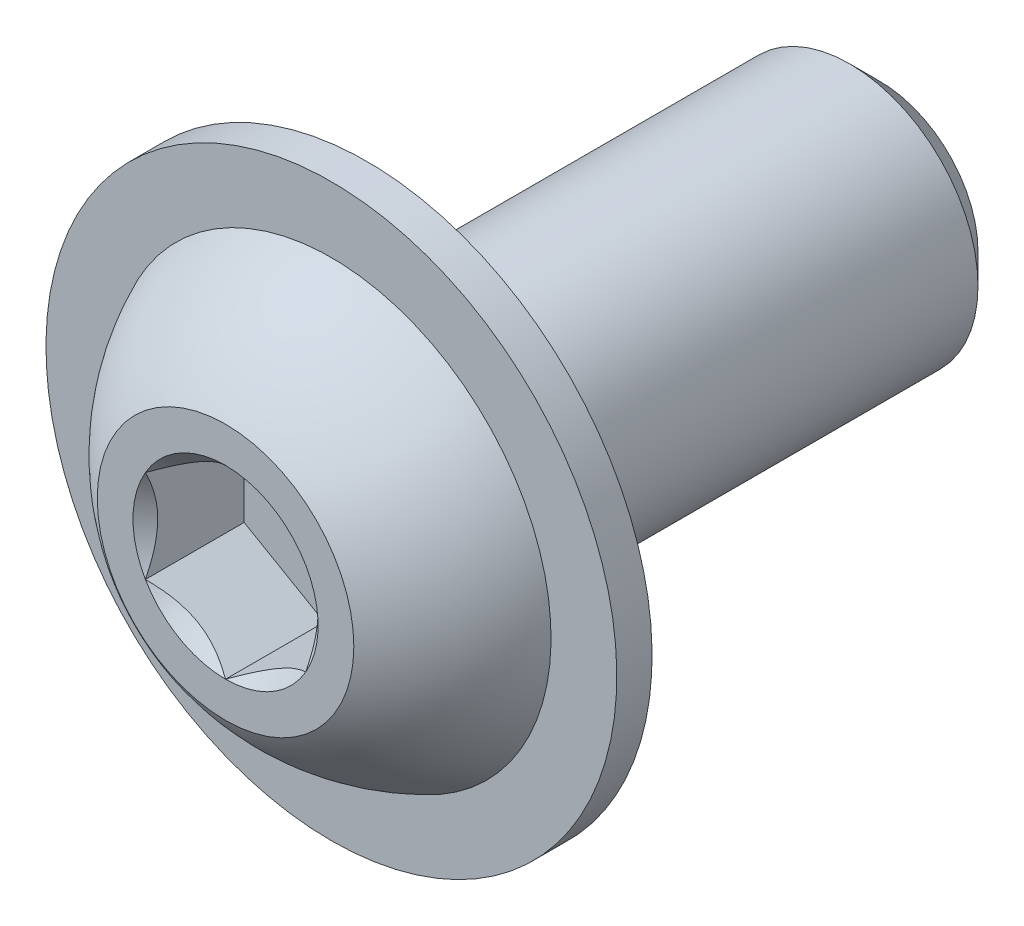
ISO-10303-21;
HEADER;
FILE_DESCRIPTION(('STEP AP214'),'2;1');
FILE_NAME('part.step','',(''),(''),'','','');
FILE_SCHEMA(('AUTOMOTIVE_DESIGN { 1 0 10303 214 1 1 1 1 }'));
ENDSEC;
DATA;
#1=APPLICATION_CONTEXT('core data for automotive mechanical design processes');
#2=APPLICATION_PROTOCOL_DEFINITION('international standard','automotive_design',2000,#1);
#3=PRODUCT_CONTEXT('',#1,'mechanical');
#4=PRODUCT('Part','Part','',(#3));
#5=PRODUCT_RELATED_PRODUCT_CATEGORY('part','',(#4));
#6=PRODUCT_DEFINITION_FORMATION('','',#4);
#7=PRODUCT_DEFINITION_CONTEXT('part definition',#1,'design');
#8=PRODUCT_DEFINITION('design','',#6,#7);
#9=PRODUCT_DEFINITION_SHAPE('','',#8);
#10=(LENGTH_UNIT() NAMED_UNIT(*) SI_UNIT(.MILLI.,.METRE.));
#11=(NAMED_UNIT(*) PLANE_ANGLE_UNIT() SI_UNIT($,.RADIAN.));
#12=(NAMED_UNIT(*) SI_UNIT($,.STERADIAN.) SOLID_ANGLE_UNIT());
#13=UNCERTAINTY_MEASURE_WITH_UNIT(LENGTH_MEASURE(1.E-05),#10,'distance_accuracy_value','');
#14=(GEOMETRIC_REPRESENTATION_CONTEXT(3) GLOBAL_UNCERTAINTY_ASSIGNED_CONTEXT((#13)) GLOBAL_UNIT_ASSIGNED_CONTEXT((#10,
#11,#12)) REPRESENTATION_CONTEXT('',''));
#15=CARTESIAN_POINT('',(0.,0.,0.));
#16=DIRECTION('',(0.,0.,1.));
#17=DIRECTION('',(1.,0.,0.));
#18=AXIS2_PLACEMENT_3D('',#15,#16,#17);
#19=CARTESIAN_POINT('',(0.,4.,-10.2));
#20=DIRECTION('',(0.,0.,1.));
#21=DIRECTION('',(1.,0.,0.));
#22=AXIS2_PLACEMENT_3D('',#19,#20,#21);
#23=PLANE('',#22);
#24=CARTESIAN_POINT('',(0.,0.,-10.2));
#25=DIRECTION('',(0.,0.,1.));
#26=DIRECTION('',(1.,0.,0.));
#27=AXIS2_PLACEMENT_3D('',#24,#25,#26);
#28=CIRCLE('',#27,3.0625);
#29=CARTESIAN_POINT('',(3.0625,0.,-10.2));
#30=VERTEX_POINT('',#29);
#31=EDGE_CURVE('E55',#30,#30,#28,.F.);
#32=ORIENTED_EDGE('',*,*,#31,.T.);
#33=EDGE_LOOP('',(#32));
#34=FACE_BOUND('',#33,.T.);
#35=ADVANCED_FACE('F40',(#34),#23,.F.);
#36=CARTESIAN_POINT('',(0.,0.,10.2));
#37=DIRECTION('',(0.,0.,1.));
#38=DIRECTION('',(1.,0.,0.));
#39=AXIS2_PLACEMENT_3D('',#36,#37,#38);
#40=CYLINDRICAL_SURFACE('',#39,4.);
#41=CARTESIAN_POINT('',(0.,0.,-9.2625));
#42=DIRECTION('',(0.,0.,1.));
#43=DIRECTION('',(1.,0.,0.));
#44=AXIS2_PLACEMENT_3D('',#41,#42,#43);
#45=CIRCLE('',#44,4.);
#46=CARTESIAN_POINT('',(4.,0.,-9.2625));
#47=VERTEX_POINT('',#46);
#48=EDGE_CURVE('E209',#47,#47,#45,.T.);
#49=ORIENTED_EDGE('',*,*,#48,.T.);
#50=EDGE_LOOP('',(#49));
#51=FACE_BOUND('',#50,.T.);
#52=CARTESIAN_POINT('',(0.,0.,5.8));
#53=DIRECTION('',(0.,0.,1.));
#54=DIRECTION('',(1.,0.,0.));
#55=AXIS2_PLACEMENT_3D('',#52,#53,#54);
#56=CIRCLE('',#55,4.);
#57=CARTESIAN_POINT('',(4.,0.,5.8));
#58=VERTEX_POINT('',#57);
#59=EDGE_CURVE('E205',#58,#58,#56,.T.);
#60=ORIENTED_EDGE('',*,*,#59,.F.);
#61=EDGE_LOOP('',(#60));
#62=FACE_BOUND('',#61,.T.);
#63=ADVANCED_FACE('F220',(#51,#62),#40,.T.);
#64=CARTESIAN_POINT('',(0.,0.,-9.2625));
#65=DIRECTION('',(0.,0.,1.));
#66=DIRECTION('',(1.,0.,0.));
#67=AXIS2_PLACEMENT_3D('',#64,#65,#66);
#68=CONICAL_SURFACE('',#67,4.,0.78539816339745);
#69=ORIENTED_EDGE('',*,*,#31,.F.);
#70=EDGE_LOOP('',(#69));
#71=FACE_BOUND('',#70,.T.);
#72=ORIENTED_EDGE('',*,*,#48,.F.);
#73=EDGE_LOOP('',(#72));
#74=FACE_BOUND('',#73,.T.);
#75=ADVANCED_FACE('F42',(#71,#74),#68,.T.);
#76=CARTESIAN_POINT('',(0.,-8.9,5.8));
#77=DIRECTION('',(0.,0.,1.));
#78=DIRECTION('',(0.,-1.,0.));
#79=AXIS2_PLACEMENT_3D('',#76,#77,#78);
#80=PLANE('',#79);
#81=CARTESIAN_POINT('',(0.,0.,5.8));
#82=DIRECTION('',(0.,0.,1.));
#83=DIRECTION('',(0.,-1.,0.));
#84=AXIS2_PLACEMENT_3D('',#81,#82,#83);
#85=CIRCLE('',#84,8.9);
#86=CARTESIAN_POINT('',(0.,-8.9,5.8));
#87=VERTEX_POINT('',#86);
#88=EDGE_CURVE('E197',#87,#87,#85,.T.);
#89=ORIENTED_EDGE('',*,*,#88,.F.);
#90=EDGE_LOOP('',(#89));
#91=FACE_BOUND('',#90,.T.);
#92=ORIENTED_EDGE('',*,*,#59,.T.);
#93=EDGE_LOOP('',(#92));
#94=FACE_BOUND('',#93,.T.);
#95=ADVANCED_FACE('F219',(#91,#94),#80,.F.);
#96=CARTESIAN_POINT('',(0.,0.,3.86477272727274));
#97=DIRECTION('',(0.,0.,1.));
#98=DIRECTION('',(0.,-1.,0.));
#99=AXIS2_PLACEMENT_3D('',#96,#97,#98);
#100=SPHERICAL_SURFACE('',#99,7.49233639108038);
#101=CARTESIAN_POINT('',(0.,0.,10.2));
#102=DIRECTION('',(0.,0.,1.));
#103=DIRECTION('',(0.,-1.,0.));
#104=AXIS2_PLACEMENT_3D('',#101,#102,#103);
#105=CIRCLE('',#104,4.);
#106=CARTESIAN_POINT('',(0.,-4.,10.2));
#107=VERTEX_POINT('',#106);
#108=EDGE_CURVE('E201',#107,#107,#105,.T.);
#109=CARTESIAN_POINT('',(0.,0.,6.9));
#110=DIRECTION('',(0.,0.,1.));
#111=DIRECTION('',(0.,-1.,0.));
#112=AXIS2_PLACEMENT_3D('',#109,#110,#111);
#113=CIRCLE('',#112,6.85);
#114=CARTESIAN_POINT('',(0.,-6.85,6.9));
#115=VERTEX_POINT('',#114);
#116=EDGE_CURVE('E189',#115,#115,#113,.T.);
#117=CARTESIAN_POINT('',(0.,-4.,10.2));
#118=CARTESIAN_POINT('',(0.,-4.03896925899167,10.175395255813));
#119=CARTESIAN_POINT('',(0.,-4.07771143871572,10.1504308650469));
#120=CARTESIAN_POINT('',(0.,-4.15472857241435,10.0997914822059));
#121=CARTESIAN_POINT('',(0.,-4.19300352638891,10.0741164901311));
#122=CARTESIAN_POINT('',(0.,-4.2690731413743,10.0220645965225));
#123=CARTESIAN_POINT('',(0.,-4.30686780238512,9.99568769498875));
#124=CARTESIAN_POINT('',(0.,-4.38196397041198,9.94224097816765));
#125=CARTESIAN_POINT('',(0.,-4.41926547742802,9.91517116288031));
#126=CARTESIAN_POINT('',(0.,-4.49336263294272,9.86034783283893));
#127=CARTESIAN_POINT('',(0.,-4.53015828144137,9.83259431808489));
#128=CARTESIAN_POINT('',(0.,-4.60323119071712,9.77641304086912));
#129=CARTESIAN_POINT('',(0.,-4.63950845149421,9.74798527840738));
#130=CARTESIAN_POINT('',(0.,-4.71153223182667,9.69046518588632));
#131=CARTESIAN_POINT('',(0.,-4.74727875138204,9.66137285582699));
#132=CARTESIAN_POINT('',(0.,-4.8182288767215,9.60253353485718));
#133=CARTESIAN_POINT('',(0.,-4.85343248250559,9.5727865439467));
#134=CARTESIAN_POINT('',(0.,-4.92328479256995,9.51264803086007));
#135=CARTESIAN_POINT('',(0.,-4.95793349685022,9.48225650868393));
#136=CARTESIAN_POINT('',(0.,-5.02666420514821,9.42083928215471));
#137=CARTESIAN_POINT('',(0.,-5.06074620916592,9.38981357780163));
#138=CARTESIAN_POINT('',(0.,-5.12833191115163,9.32713855195595));
#139=CARTESIAN_POINT('',(0.,-5.16183560911962,9.29548923046334));
#140=CARTESIAN_POINT('',(0.,-5.22825329014773,9.23157774773517));
#141=CARTESIAN_POINT('',(0.,-5.26116727320785,9.1993155864996));
#142=CARTESIAN_POINT('',(0.,-5.32639431637462,9.13418941036908));
#143=CARTESIAN_POINT('',(0.,-5.35870737648127,9.10132539547412));
#144=CARTESIAN_POINT('',(0.,-5.42272157032509,9.03500670305495));
#145=CARTESIAN_POINT('',(0.,-5.45442270406226,9.00155202553073));
#146=CARTESIAN_POINT('',(0.,-5.51720225012754,8.93406340001871));
#147=CARTESIAN_POINT('',(0.,-5.54828066245565,8.90002945203091));
#148=CARTESIAN_POINT('',(0.,-5.60980418271563,8.83139387501372));
#149=CARTESIAN_POINT('',(0.,-5.64024929064751,8.79679224598432));
#150=CARTESIAN_POINT('',(0.,-5.70049583478407,8.72703308961567));
#151=CARTESIAN_POINT('',(0.,-5.73029727098875,8.69187556227643));
#152=CARTESIAN_POINT('',(0.,-5.7892463235265,8.6210165813173));
#153=CARTESIAN_POINT('',(0.,-5.81839393985956,8.58531512769742));
#154=CARTESIAN_POINT('',(0.,-5.87602542715189,8.51338045142695));
#155=CARTESIAN_POINT('',(0.,-5.90450929811115,8.47714722877635));
#156=CARTESIAN_POINT('',(0.,-5.96080359517582,8.40416135277517));
#157=CARTESIAN_POINT('',(0.,-5.98861402128122,8.36740869942459));
#158=CARTESIAN_POINT('',(0.,-6.04355195848312,8.2933964772335));
#159=CARTESIAN_POINT('',(0.,-6.07067946957962,8.25613690839299));
#160=CARTESIAN_POINT('',(0.,-6.12424233915866,8.18112354304971));
#161=CARTESIAN_POINT('',(0.,-6.15067769764121,8.14336974654695));
#162=CARTESIAN_POINT('',(0.,-6.20284726008234,8.06738078200367));
#163=CARTESIAN_POINT('',(0.,-6.22858146404091,8.02914561396316));
#164=CARTESIAN_POINT('',(0.,-6.27933995428679,7.95220692638894));
#165=CARTESIAN_POINT('',(0.,-6.30436424057411,7.91350340685525));
#166=CARTESIAN_POINT('',(0.,-6.3536943740682,7.83564119582157));
#167=CARTESIAN_POINT('',(0.,-6.37800022127497,7.79648250432158));
#168=CARTESIAN_POINT('',(0.,-6.42588519987143,7.7177232838919));
#169=CARTESIAN_POINT('',(0.,-6.44946433126112,7.67812275496221));
#170=CARTESIAN_POINT('',(0.,-6.49588784885487,7.59849334462135));
#171=CARTESIAN_POINT('',(0.,-6.51873223505892,7.55846446321018));
#172=CARTESIAN_POINT('',(0.,-6.56367848347486,7.47799197888821));
#173=CARTESIAN_POINT('',(0.,-6.58578034568675,7.43754837597742));
#174=CARTESIAN_POINT('',(0.,-6.62923401880661,7.35626022023141));
#175=CARTESIAN_POINT('',(0.,-6.65058582971459,7.3154156673962));
#176=CARTESIAN_POINT('',(0.,-6.69253213337748,7.23333952226075));
#177=CARTESIAN_POINT('',(0.,-6.71312662613239,7.19210792996052));
#178=CARTESIAN_POINT('',(0.,-6.75355126567506,7.1092717393787));
#179=CARTESIAN_POINT('',(0.,-6.77338141246283,7.06766714109712));
#180=CARTESIAN_POINT('',(0.,-6.812270662889,6.98409913179358));
#181=CARTESIAN_POINT('',(0.,-6.8313297665274,6.94213572077163));
#182=CARTESIAN_POINT('',(0.,-6.85,6.9));
#183=B_SPLINE_CURVE_WITH_KNOTS('',3,(#117,#118,#119,#120,#121,#122,#123,#124,#125,#126,#127,
#128,#129,#130,#131,#132,#133,#134,#135,#136,#137,#138,#139,#140,#141,#142,#143,#144,#145,#146,
#147,#148,#149,#150,#151,#152,#153,#154,#155,#156,#157,#158,#159,#160,#161,#162,#163,#164,#165,
#166,#167,#168,#169,#170,#171,#172,#173,#174,#175,#176,#177,#178,#179,#180,#181,#182),
.UNSPECIFIED.,.F.,.F.,(4,2,2,2,2,2,2,2,2,2,2,2,2,2,2,2,2,2,2,2,2,2,2,2,2,2,2,2,2,2,2,2,4),(0.,
0.138258547689302,0.276517095378602,0.414775643067903,0.553034190757204,0.691292738446505,
0.829551286135807,0.967809833825108,1.10606838151441,1.24432692920371,1.38258547689301,
1.52084402458231,1.65910257227161,1.79736111996091,1.93561966765021,2.07387821533952,
2.21213676302881,2.35039531071812,2.48865385840742,2.62691240609672,2.76517095378602,
2.90342950147532,3.04168804916462,3.17994659685392,3.31820514454322,3.45646369223252,
3.59472223992182,3.73298078761113,3.87123933530043,4.00949788298973,4.14775643067903,
4.28601497836833,4.42427352605763),.UNSPECIFIED.);
#184=EDGE_CURVE('BSEAM229',#107,#115,#183,.T.);
#185=ORIENTED_EDGE('',*,*,#108,.F.);
#186=ORIENTED_EDGE('',*,*,#116,.T.);
#187=ORIENTED_EDGE('',*,*,#184,.T.);
#188=ORIENTED_EDGE('',*,*,#184,.F.);
#189=EDGE_LOOP('',(#185,#187,#186,#188));
#190=FACE_BOUND('',#189,.T.);
#191=ADVANCED_FACE('F229',(#190),#100,.T.);
#192=CARTESIAN_POINT('',(0.,-4.,10.2));
#193=DIRECTION('',(0.,0.,-1.));
#194=DIRECTION('',(0.,1.,0.));
#195=AXIS2_PLACEMENT_3D('',#192,#193,#194);
#196=PLANE('',#195);
#197=CARTESIAN_POINT('',(0.,0.,10.2));
#198=DIRECTION('',(0.,0.,1.));
#199=DIRECTION('',(1.,0.,0.));
#200=AXIS2_PLACEMENT_3D('',#197,#198,#199);
#201=CIRCLE('',#200,2.88675134594813);
#202=CARTESIAN_POINT('',(0.,2.88675134594813,10.2));
#203=VERTEX_POINT('',#202);
#204=CARTESIAN_POINT('',(-2.5,1.44337567297406,10.2));
#205=VERTEX_POINT('',#204);
#206=EDGE_CURVE('E146',#203,#205,#201,.T.);
#207=ORIENTED_EDGE('',*,*,#206,.F.);
#208=CARTESIAN_POINT('',(2.5,1.44337567297406,10.2));
#209=VERTEX_POINT('',#208);
#210=EDGE_CURVE('E141',#209,#203,#201,.T.);
#211=ORIENTED_EDGE('',*,*,#210,.F.);
#212=CARTESIAN_POINT('',(2.5,-1.44337567297406,10.2));
#213=VERTEX_POINT('',#212);
#214=EDGE_CURVE('E109',#213,#209,#201,.T.);
#215=ORIENTED_EDGE('',*,*,#214,.F.);
#216=CARTESIAN_POINT('',(0.,-2.88675134594813,10.2));
#217=VERTEX_POINT('',#216);
#218=EDGE_CURVE('E100',#217,#213,#201,.T.);
#219=ORIENTED_EDGE('',*,*,#218,.F.);
#220=CARTESIAN_POINT('',(-2.5,-1.44337567297406,10.2));
#221=VERTEX_POINT('',#220);
#222=EDGE_CURVE('E61',#221,#217,#201,.T.);
#223=ORIENTED_EDGE('',*,*,#222,.F.);
#224=EDGE_CURVE('E68',#205,#221,#201,.T.);
#225=ORIENTED_EDGE('',*,*,#224,.F.);
#226=EDGE_LOOP('',(#207,#211,#215,#219,#223,#225));
#227=FACE_BOUND('',#226,.T.);
#228=ORIENTED_EDGE('',*,*,#108,.T.);
#229=EDGE_LOOP('',(#228));
#230=FACE_BOUND('',#229,.T.);
#231=ADVANCED_FACE('F138',(#227,#230),#196,.F.);
#232=CARTESIAN_POINT('',(0.,0.,10.2));
#233=DIRECTION('',(0.,0.,1.));
#234=DIRECTION('',(0.,-1.,0.));
#235=AXIS2_PLACEMENT_3D('',#232,#233,#234);
#236=CYLINDRICAL_SURFACE('',#235,8.9);
#237=CARTESIAN_POINT('',(0.,0.,6.9));
#238=DIRECTION('',(0.,0.,1.));
#239=DIRECTION('',(0.,-1.,0.));
#240=AXIS2_PLACEMENT_3D('',#237,#238,#239);
#241=CIRCLE('',#240,8.9);
#242=CARTESIAN_POINT('',(0.,-8.9,6.9));
#243=VERTEX_POINT('',#242);
#244=EDGE_CURVE('E193',#243,#243,#241,.T.);
#245=ORIENTED_EDGE('',*,*,#244,.F.);
#246=EDGE_LOOP('',(#245));
#247=FACE_BOUND('',#246,.T.);
#248=ORIENTED_EDGE('',*,*,#88,.T.);
#249=EDGE_LOOP('',(#248));
#250=FACE_BOUND('',#249,.T.);
#251=ADVANCED_FACE('F244',(#247,#250),#236,.T.);
#252=CARTESIAN_POINT('',(0.,-6.85,6.9));
#253=DIRECTION('',(0.,0.,-1.));
#254=DIRECTION('',(0.,1.,0.));
#255=AXIS2_PLACEMENT_3D('',#252,#253,#254);
#256=PLANE('',#255);
#257=ORIENTED_EDGE('',*,*,#116,.F.);
#258=EDGE_LOOP('',(#257));
#259=FACE_BOUND('',#258,.T.);
#260=ORIENTED_EDGE('',*,*,#244,.T.);
#261=EDGE_LOOP('',(#260));
#262=FACE_BOUND('',#261,.T.);
#263=ADVANCED_FACE('F248',(#259,#262),#256,.F.);
#264=CARTESIAN_POINT('',(0.,0.,10.2));
#265=DIRECTION('',(0.,0.,1.));
#266=DIRECTION('',(1.,0.,0.));
#267=AXIS2_PLACEMENT_3D('',#264,#265,#266);
#268=CONICAL_SURFACE('',#267,2.88675134594813,0.78539816339745);
#269=ORIENTED_EDGE('',*,*,#214,.T.);
#270=CARTESIAN_POINT('',(2.5,-2.87868021616154,11.1259641937847));
#271=CARTESIAN_POINT('',(2.5,-2.80858751756355,11.0730547693995));
#272=CARTESIAN_POINT('',(2.5,-2.73810237384458,11.0206567848064));
#273=CARTESIAN_POINT('',(2.5,-2.59619238907469,10.9171126835152));
#274=CARTESIAN_POINT('',(2.5,-2.52476731657143,10.8659668843779));
#275=CARTESIAN_POINT('',(2.5,-2.38030019419698,10.7647924979814));
#276=CARTESIAN_POINT('',(2.5,-2.307249903594,10.7147756377845));
#277=CARTESIAN_POINT('',(2.5,-2.15990937397294,10.6166088439155));
#278=CARTESIAN_POINT('',(2.5,-2.08561922308943,10.5684587783455));
#279=CARTESIAN_POINT('',(2.5,-1.93130274871409,10.471746559452));
#280=CARTESIAN_POINT('',(2.5,-1.8511916849785,10.4233189325373));
#281=CARTESIAN_POINT('',(2.5,-1.68912282627168,10.3296640597041));
#282=CARTESIAN_POINT('',(2.5,-1.60716527674864,10.2844363916948));
#283=CARTESIAN_POINT('',(2.5,-1.44137668632319,10.1981353746693));
#284=CARTESIAN_POINT('',(2.5,-1.35755175925796,10.1570503726636));
#285=CARTESIAN_POINT('',(2.5,-1.1876157775942,10.0799618661066));
#286=CARTESIAN_POINT('',(2.5,-1.10150577924729,10.0439560607346));
#287=CARTESIAN_POINT('',(2.5,-0.933895283730374,9.98094974428509));
#288=CARTESIAN_POINT('',(2.5,-0.852581486652412,9.9534577201431));
#289=CARTESIAN_POINT('',(2.5,-0.687996185051426,9.9049971144174));
#290=CARTESIAN_POINT('',(2.5,-0.604724546085163,9.88402898223896));
#291=CARTESIAN_POINT('',(2.5,-0.438105786501649,9.85005999501303));
#292=CARTESIAN_POINT('',(2.5,-0.354786957377881,9.83692263344361));
#293=CARTESIAN_POINT('',(2.5,-0.187258638268771,9.8188701943996));
#294=CARTESIAN_POINT('',(2.5,-0.103049303891732,9.81395370353016));
#295=CARTESIAN_POINT('',(2.5,0.0623819458555502,9.8127080743719));
#296=CARTESIAN_POINT('',(2.5,0.143601667742495,9.81607455171089));
#297=CARTESIAN_POINT('',(2.5,0.305344840533965,9.83053759238092));
#298=CARTESIAN_POINT('',(2.5,0.385868223029658,9.84163490665309));
#299=CARTESIAN_POINT('',(2.5,0.546999992477731,9.87114207858534));
#300=CARTESIAN_POINT('',(2.5,0.62758525815638,9.88967637683092));
#301=CARTESIAN_POINT('',(2.5,0.786991930978587,9.93307233201407));
#302=CARTESIAN_POINT('',(2.5,0.865813485110825,9.95793345951744));
#303=CARTESIAN_POINT('',(2.5,1.11399280220491,10.0455589112399));
#304=CARTESIAN_POINT('',(2.5,1.27984027529456,10.1183033354746));
#305=CARTESIAN_POINT('',(2.5,1.52253018655038,10.2395423452678));
#306=CARTESIAN_POINT('',(2.5,1.60256472908879,10.2820714512072));
#307=CARTESIAN_POINT('',(2.5,1.76081489282125,10.3703965241522));
#308=CARTESIAN_POINT('',(2.5,1.83903083842887,10.4161919024767));
#309=CARTESIAN_POINT('',(2.5,1.99000684607168,10.5080446787286));
#310=CARTESIAN_POINT('',(2.5,2.06284472030444,10.5539756354245));
#311=CARTESIAN_POINT('',(2.5,2.20727164736135,10.6477702453865));
#312=CARTESIAN_POINT('',(2.5,2.27886060500402,10.6956340450436));
#313=CARTESIAN_POINT('',(2.5,2.42037078548403,10.7925522363183));
#314=CARTESIAN_POINT('',(2.5,2.49030083172878,10.8415937983162));
#315=CARTESIAN_POINT('',(2.5,2.62920524991558,10.9409738351898));
#316=CARTESIAN_POINT('',(2.5,2.69817987937839,10.9913119497074));
#317=CARTESIAN_POINT('',(2.5,2.76675463365823,11.0421802976824));
#318=B_SPLINE_CURVE_WITH_KNOTS('',3,(#270,#271,#272,#273,#274,#275,#276,#277,#278,#279,#280,
#281,#282,#283,#284,#285,#286,#287,#288,#289,#290,#291,#292,#293,#294,#295,#296,#297,#298,#299,
#300,#301,#302,#303,#304,#305,#306,#307,#308,#309,#310,#311,#312,#313,#314,#315,#316,#317),
.UNSPECIFIED.,.F.,.F.,(4,2,2,2,2,2,2,2,2,2,2,2,2,2,2,2,2,2,2,2,2,2,2,4),(0.,0.263465914971114,
0.526997968323236,0.792571943279359,1.05812711983771,1.33890112548018,1.61963802629078,
1.89956181222216,2.17935838571897,2.436638876826,2.69393708705247,2.94660788173135,
3.19923523085016,3.44271854486786,3.68622551313359,3.93398926860573,4.18173229781968,
4.72334004841908,4.99521600382014,5.26704308216966,5.52534341671993,5.78366335141086,
6.03988492204046,6.29603603207541),.UNSPECIFIED.);
#319=EDGE_CURVE('E11',#213,#209,#318,.T.);
#320=ORIENTED_EDGE('',*,*,#319,.F.);
#321=EDGE_LOOP('',(#269,#320));
#322=FACE_BOUND('',#321,.T.);
#323=ADVANCED_FACE('F113',(#322),#268,.F.);
#324=ORIENTED_EDGE('',*,*,#210,.T.);
#325=CARTESIAN_POINT('',(2.5002,1.44326020292023,10.2001154769818));
#326=CARTESIAN_POINT('',(2.41426172221224,1.49287669073469,10.1505407053547));
#327=CARTESIAN_POINT('',(2.32688643272425,1.5433228376411,10.1038774813625));
#328=CARTESIAN_POINT('',(2.14871854383441,1.64618811625259,10.0184381400383));
#329=CARTESIAN_POINT('',(2.05790899931893,1.69861703122359,9.979709562406));
#330=CARTESIAN_POINT('',(1.87479587687308,1.80433744175986,9.91336670389774));
#331=CARTESIAN_POINT('',(1.78253893547066,1.85760201171316,9.88558566853085));
#332=CARTESIAN_POINT('',(1.59599399122371,1.96530378549009,9.84278317591066));
#333=CARTESIAN_POINT('',(1.50171168743372,2.01973769896307,9.82772976667134));
#334=CARTESIAN_POINT('',(1.33922174170815,2.11355131286833,9.81414772220948));
#335=CARTESIAN_POINT('',(1.27122403211985,2.15280980880341,9.8121370992408));
#336=CARTESIAN_POINT('',(1.13533975883078,2.23126263056549,9.81552411718749));
#337=CARTESIAN_POINT('',(1.06745324244776,2.27045692907358,9.82092435529982));
#338=CARTESIAN_POINT('',(0.932321211763893,2.34847544336505,9.83882578840247));
#339=CARTESIAN_POINT('',(0.865076500246438,2.38729919566123,9.85133492704648));
#340=CARTESIAN_POINT('',(0.7317498991818,2.46427534467604,9.88276750195571));
#341=CARTESIAN_POINT('',(0.665667920900341,2.50242779262542,9.90169044649682));
#342=CARTESIAN_POINT('',(0.496403653308734,2.60015256308362,9.95786736140825));
#343=CARTESIAN_POINT('',(0.394270877777106,2.65911894852989,9.99935583159619));
#344=CARTESIAN_POINT('',(0.244093585059491,2.74582384890657,10.0693940467231));
#345=CARTESIAN_POINT('',(0.19460346011739,2.77439698586412,10.0940022521161));
#346=CARTESIAN_POINT('',(0.0965399361611531,2.83101398781794,10.1454618867152));
#347=CARTESIAN_POINT('',(0.047965996503072,2.85905816495513,10.1723119387794));
#348=CARTESIAN_POINT('',(-0.000199999999999969,2.88686681600197,10.2001154769818));
#349=B_SPLINE_CURVE_WITH_KNOTS('',3,(#325,#326,#327,#328,#329,#330,#331,#332,#333,#334,#335,
#336,#337,#338,#339,#340,#341,#342,#343,#344,#345,#346,#347,#348),.UNSPECIFIED.,.F.,.F.,(4,2,2,
2,2,2,2,2,2,2,2,4),(0.,0.333012085133925,0.667964518301399,0.997597032043301,1.32639954393845,
1.56169424147169,1.79707142102083,2.03271213522171,2.26833478775651,2.64260240809533,
2.82922877818864,3.01574133749025),.UNSPECIFIED.);
#350=EDGE_CURVE('E145',#209,#203,#349,.T.);
#351=ORIENTED_EDGE('',*,*,#350,.F.);
#352=EDGE_LOOP('',(#324,#351));
#353=FACE_BOUND('',#352,.T.);
#354=ADVANCED_FACE('F338',(#353),#268,.F.);
#355=ORIENTED_EDGE('',*,*,#206,.T.);
#356=CARTESIAN_POINT('',(0.000199999999999368,2.88686681600197,10.2001154769818));
#357=CARTESIAN_POINT('',(-0.0857382777877655,2.83725032818751,10.1505407053547));
#358=CARTESIAN_POINT('',(-0.173113567275754,2.7868041812811,10.1038774813625));
#359=CARTESIAN_POINT('',(-0.351281456165589,2.6839389026696,10.0184381400383));
#360=CARTESIAN_POINT('',(-0.442091000681076,2.6315099876986,9.979709562406));
#361=CARTESIAN_POINT('',(-0.625204123126922,2.52578957716234,9.91336670389774));
#362=CARTESIAN_POINT('',(-0.717461064529341,2.47252500720904,9.88558566853085));
#363=CARTESIAN_POINT('',(-0.904006008776286,2.3648232334321,9.84278317591066));
#364=CARTESIAN_POINT('',(-0.998288312566284,2.31038931995913,9.82772976667134));
#365=CARTESIAN_POINT('',(-1.16077825829185,2.21657570605387,9.81414772220948));
#366=CARTESIAN_POINT('',(-1.22877596788015,2.17731721011878,9.8121370992408));
#367=CARTESIAN_POINT('',(-1.36466024116922,2.0988643883567,9.81552411718749));
#368=CARTESIAN_POINT('',(-1.43254675755224,2.05967008984862,9.82092435529982));
#369=CARTESIAN_POINT('',(-1.56767878823611,1.98165157555715,9.83882578840247));
#370=CARTESIAN_POINT('',(-1.63492349975356,1.94282782326097,9.85133492704648));
#371=CARTESIAN_POINT('',(-1.7682501008182,1.86585167424616,9.88276750195571));
#372=CARTESIAN_POINT('',(-1.83433207909966,1.82769922629678,9.90169044649682));
#373=CARTESIAN_POINT('',(-2.00359634669126,1.72997445583858,9.95786736140825));
#374=CARTESIAN_POINT('',(-2.10572912222289,1.67100807039231,9.99935583159619));
#375=CARTESIAN_POINT('',(-2.25590641494051,1.58430317001562,10.0693940467231));
#376=CARTESIAN_POINT('',(-2.30539653988261,1.55573003305807,10.0940022521161));
#377=CARTESIAN_POINT('',(-2.40346006383885,1.49911303110426,10.1454618867152));
#378=CARTESIAN_POINT('',(-2.45203400349693,1.47106885396706,10.1723119387794));
#379=CARTESIAN_POINT('',(-2.5002,1.44326020292023,10.2001154769818));
#380=B_SPLINE_CURVE_WITH_KNOTS('',3,(#356,#357,#358,#359,#360,#361,#362,#363,#364,#365,#366,
#367,#368,#369,#370,#371,#372,#373,#374,#375,#376,#377,#378,#379),.UNSPECIFIED.,.F.,.F.,(4,2,2,
2,2,2,2,2,2,2,2,4),(0.,0.333012085133923,0.667964518301397,0.997597032043298,1.32639954393844,
1.56169424147169,1.79707142102083,2.03271213522171,2.26833478775651,2.64260240809533,
2.82922877818864,3.01574133749025),.UNSPECIFIED.);
#381=EDGE_CURVE('E151',#203,#205,#380,.T.);
#382=ORIENTED_EDGE('',*,*,#381,.F.);
#383=EDGE_LOOP('',(#355,#382));
#384=FACE_BOUND('',#383,.T.);
#385=ADVANCED_FACE('F156',(#384),#268,.F.);
#386=ORIENTED_EDGE('',*,*,#224,.T.);
#387=CARTESIAN_POINT('',(-2.5,-2.87868021616154,11.1259641937847));
#388=CARTESIAN_POINT('',(-2.5,-2.80858751756355,11.0730547693995));
#389=CARTESIAN_POINT('',(-2.5,-2.73810237384458,11.0206567848064));
#390=CARTESIAN_POINT('',(-2.5,-2.59619238907469,10.9171126835152));
#391=CARTESIAN_POINT('',(-2.5,-2.52476731657143,10.8659668843779));
#392=CARTESIAN_POINT('',(-2.5,-2.38030019419698,10.7647924979814));
#393=CARTESIAN_POINT('',(-2.5,-2.307249903594,10.7147756377845));
#394=CARTESIAN_POINT('',(-2.5,-2.15990937397294,10.6166088439155));
#395=CARTESIAN_POINT('',(-2.5,-2.08561922308943,10.5684587783455));
#396=CARTESIAN_POINT('',(-2.5,-1.93130274871409,10.471746559452));
#397=CARTESIAN_POINT('',(-2.5,-1.8511916849785,10.4233189325373));
#398=CARTESIAN_POINT('',(-2.5,-1.68912282627168,10.3296640597041));
#399=CARTESIAN_POINT('',(-2.5,-1.60716527674864,10.2844363916948));
#400=CARTESIAN_POINT('',(-2.5,-1.44137668632319,10.1981353746693));
#401=CARTESIAN_POINT('',(-2.5,-1.35755175925796,10.1570503726636));
#402=CARTESIAN_POINT('',(-2.5,-1.18761577759421,10.0799618661066));
#403=CARTESIAN_POINT('',(-2.5,-1.10150577924729,10.0439560607346));
#404=CARTESIAN_POINT('',(-2.5,-0.933895283730375,9.98094974428509));
#405=CARTESIAN_POINT('',(-2.5,-0.852581486652413,9.9534577201431));
#406=CARTESIAN_POINT('',(-2.5,-0.687996185051426,9.9049971144174));
#407=CARTESIAN_POINT('',(-2.5,-0.604724546085164,9.88402898223896));
#408=CARTESIAN_POINT('',(-2.5,-0.43810578650165,9.85005999501303));
#409=CARTESIAN_POINT('',(-2.5,-0.354786957377882,9.83692263344361));
#410=CARTESIAN_POINT('',(-2.5,-0.187258638268773,9.8188701943996));
#411=CARTESIAN_POINT('',(-2.5,-0.103049303891733,9.81395370353016));
#412=CARTESIAN_POINT('',(-2.5,0.0623819458555491,9.8127080743719));
#413=CARTESIAN_POINT('',(-2.5,0.143601667742494,9.81607455171089));
#414=CARTESIAN_POINT('',(-2.5,0.305344840533964,9.83053759238092));
#415=CARTESIAN_POINT('',(-2.5,0.385868223029658,9.84163490665309));
#416=CARTESIAN_POINT('',(-2.5,0.54699999247773,9.87114207858534));
#417=CARTESIAN_POINT('',(-2.5,0.627585258156379,9.88967637683092));
#418=CARTESIAN_POINT('',(-2.5,0.786991930978587,9.93307233201407));
#419=CARTESIAN_POINT('',(-2.5,0.865813485110824,9.95793345951744));
#420=CARTESIAN_POINT('',(-2.5,1.11399280220491,10.0455589112399));
#421=CARTESIAN_POINT('',(-2.5,1.27984027529456,10.1183033354746));
#422=CARTESIAN_POINT('',(-2.5,1.52253018655038,10.2395423452678));
#423=CARTESIAN_POINT('',(-2.5,1.60256472908879,10.2820714512072));
#424=CARTESIAN_POINT('',(-2.5,1.76081489282125,10.3703965241522));
#425=CARTESIAN_POINT('',(-2.5,1.83903083842887,10.4161919024767));
#426=CARTESIAN_POINT('',(-2.5,1.99000684607168,10.5080446787286));
#427=CARTESIAN_POINT('',(-2.5,2.06284472030444,10.5539756354245));
#428=CARTESIAN_POINT('',(-2.5,2.20727164736135,10.6477702453865));
#429=CARTESIAN_POINT('',(-2.5,2.27886060500402,10.6956340450436));
#430=CARTESIAN_POINT('',(-2.5,2.42037078548403,10.7925522363183));
#431=CARTESIAN_POINT('',(-2.5,2.49030083172878,10.8415937983162));
#432=CARTESIAN_POINT('',(-2.5,2.62920524991558,10.9409738351898));
#433=CARTESIAN_POINT('',(-2.5,2.69817987937839,10.9913119497074));
#434=CARTESIAN_POINT('',(-2.5,2.76675463365823,11.0421802976824));
#435=B_SPLINE_CURVE_WITH_KNOTS('',3,(#387,#388,#389,#390,#391,#392,#393,#394,#395,#396,#397,
#398,#399,#400,#401,#402,#403,#404,#405,#406,#407,#408,#409,#410,#411,#412,#413,#414,#415,#416,
#417,#418,#419,#420,#421,#422,#423,#424,#425,#426,#427,#428,#429,#430,#431,#432,#433,#434),
.UNSPECIFIED.,.F.,.F.,(4,2,2,2,2,2,2,2,2,2,2,2,2,2,2,2,2,2,2,2,2,2,2,4),(0.,0.263465914971116,
0.526997968323239,0.792571943279361,1.05812711983771,1.33890112548018,1.61963802629079,
1.89956181222216,2.17935838571897,2.436638876826,2.69393708705248,2.94660788173135,
3.19923523085016,3.44271854486786,3.68622551313359,3.93398926860573,4.18173229781968,
4.72334004841908,4.99521600382014,5.26704308216966,5.52534341671993,5.78366335141086,
6.03988492204046,6.29603603207541),.UNSPECIFIED.);
#436=EDGE_CURVE('E159',#205,#221,#435,.F.);
#437=ORIENTED_EDGE('',*,*,#436,.F.);
#438=EDGE_LOOP('',(#386,#437));
#439=FACE_BOUND('',#438,.T.);
#440=ADVANCED_FACE('F160',(#439),#268,.F.);
#441=ORIENTED_EDGE('',*,*,#222,.T.);
#442=CARTESIAN_POINT('',(-2.5002,-1.44326020292023,10.2001154769818));
#443=CARTESIAN_POINT('',(-2.41426172221224,-1.49287669073469,10.1505407053547));
#444=CARTESIAN_POINT('',(-2.32688643272425,-1.5433228376411,10.1038774813625));
#445=CARTESIAN_POINT('',(-2.14871854383441,-1.64618811625259,10.0184381400383));
#446=CARTESIAN_POINT('',(-2.05790899931893,-1.69861703122359,9.979709562406));
#447=CARTESIAN_POINT('',(-1.87479587687308,-1.80433744175986,9.91336670389774));
#448=CARTESIAN_POINT('',(-1.78253893547066,-1.85760201171316,9.88558566853086));
#449=CARTESIAN_POINT('',(-1.59599399122372,-1.96530378549009,9.84278317591067));
#450=CARTESIAN_POINT('',(-1.50171168743372,-2.01973769896307,9.82772976667134));
#451=CARTESIAN_POINT('',(-1.33922174170816,-2.11355131286833,9.81414772220948));
#452=CARTESIAN_POINT('',(-1.27122403211985,-2.15280980880341,9.8121370992408));
#453=CARTESIAN_POINT('',(-1.13533975883078,-2.23126263056549,9.81552411718749));
#454=CARTESIAN_POINT('',(-1.06745324244776,-2.27045692907358,9.82092435529982));
#455=CARTESIAN_POINT('',(-0.932321211763896,-2.34847544336505,9.83882578840247));
#456=CARTESIAN_POINT('',(-0.865076500246442,-2.38729919566123,9.85133492704648));
#457=CARTESIAN_POINT('',(-0.731749899181803,-2.46427534467604,9.88276750195571));
#458=CARTESIAN_POINT('',(-0.665667920900345,-2.50242779262542,9.90169044649682));
#459=CARTESIAN_POINT('',(-0.496403653308737,-2.60015256308362,9.95786736140825));
#460=CARTESIAN_POINT('',(-0.394270877777109,-2.65911894852989,9.99935583159619));
#461=CARTESIAN_POINT('',(-0.244093585059492,-2.74582384890657,10.0693940467231));
#462=CARTESIAN_POINT('',(-0.194603460117392,-2.77439698586412,10.0940022521161));
#463=CARTESIAN_POINT('',(-0.0965399361611538,-2.83101398781794,10.1454618867152));
#464=CARTESIAN_POINT('',(-0.0479659965030724,-2.85905816495513,10.1723119387794));
#465=CARTESIAN_POINT('',(0.000200000000000091,-2.88686681600197,10.2001154769818));
#466=B_SPLINE_CURVE_WITH_KNOTS('',3,(#442,#443,#444,#445,#446,#447,#448,#449,#450,#451,#452,
#453,#454,#455,#456,#457,#458,#459,#460,#461,#462,#463,#464,#465),.UNSPECIFIED.,.F.,.F.,(4,2,2,
2,2,2,2,2,2,2,2,4),(0.,0.333012085133923,0.667964518301396,0.997597032043298,1.32639954393844,
1.56169424147168,1.79707142102083,2.03271213522171,2.2683347877565,2.64260240809533,
2.82922877818864,3.01574133749025),.UNSPECIFIED.);
#467=EDGE_CURVE('E126',#221,#217,#466,.T.);
#468=ORIENTED_EDGE('',*,*,#467,.F.);
#469=EDGE_LOOP('',(#441,#468));
#470=FACE_BOUND('',#469,.T.);
#471=ADVANCED_FACE('F279',(#470),#268,.F.);
#472=ORIENTED_EDGE('',*,*,#218,.T.);
#473=CARTESIAN_POINT('',(-0.00019999999999988,-2.88686681600197,10.2001154769818));
#474=CARTESIAN_POINT('',(0.0857382777877651,-2.83725032818751,10.1505407053547));
#475=CARTESIAN_POINT('',(0.173113567275754,-2.7868041812811,10.1038774813625));
#476=CARTESIAN_POINT('',(0.351281456165589,-2.6839389026696,10.0184381400383));
#477=CARTESIAN_POINT('',(0.442091000681076,-2.6315099876986,9.979709562406));
#478=CARTESIAN_POINT('',(0.625204123126922,-2.52578957716234,9.91336670389774));
#479=CARTESIAN_POINT('',(0.717461064529342,-2.47252500720904,9.88558566853085));
#480=CARTESIAN_POINT('',(0.904006008776288,-2.3648232334321,9.84278317591066));
#481=CARTESIAN_POINT('',(0.998288312566286,-2.31038931995913,9.82772976667134));
#482=CARTESIAN_POINT('',(1.16077825829185,-2.21657570605387,9.81414772220948));
#483=CARTESIAN_POINT('',(1.22877596788015,-2.17731721011878,9.8121370992408));
#484=CARTESIAN_POINT('',(1.36466024116922,-2.0988643883567,9.81552411718749));
#485=CARTESIAN_POINT('',(1.43254675755224,-2.05967008984862,9.82092435529982));
#486=CARTESIAN_POINT('',(1.56767878823611,-1.98165157555715,9.83882578840247));
#487=CARTESIAN_POINT('',(1.63492349975356,-1.94282782326096,9.85133492704648));
#488=CARTESIAN_POINT('',(1.7682501008182,-1.86585167424616,9.88276750195571));
#489=CARTESIAN_POINT('',(1.83433207909966,-1.82769922629677,9.90169044649682));
#490=CARTESIAN_POINT('',(2.00359634669127,-1.72997445583858,9.95786736140825));
#491=CARTESIAN_POINT('',(2.1057291222229,-1.67100807039231,9.99935583159619));
#492=CARTESIAN_POINT('',(2.25590641494051,-1.58430317001562,10.0693940467231));
#493=CARTESIAN_POINT('',(2.30539653988261,-1.55573003305807,10.0940022521161));
#494=CARTESIAN_POINT('',(2.40346006383885,-1.49911303110426,10.1454618867152));
#495=CARTESIAN_POINT('',(2.45203400349693,-1.47106885396706,10.1723119387794));
#496=CARTESIAN_POINT('',(2.5002,-1.44326020292023,10.2001154769818));
#497=B_SPLINE_CURVE_WITH_KNOTS('',3,(#473,#474,#475,#476,#477,#478,#479,#480,#481,#482,#483,
#484,#485,#486,#487,#488,#489,#490,#491,#492,#493,#494,#495,#496),.UNSPECIFIED.,.F.,.F.,(4,2,2,
2,2,2,2,2,2,2,2,4),(0.,0.333012085133925,0.667964518301399,0.997597032043302,1.32639954393845,
1.56169424147169,1.79707142102083,2.03271213522171,2.26833478775651,2.64260240809533,
2.82922877818864,3.01574133749025),.UNSPECIFIED.);
#498=EDGE_CURVE('E104',#217,#213,#497,.T.);
#499=ORIENTED_EDGE('',*,*,#498,.F.);
#500=EDGE_LOOP('',(#472,#499));
#501=FACE_BOUND('',#500,.T.);
#502=ADVANCED_FACE('F102',(#501),#268,.F.);
#503=CARTESIAN_POINT('',(2.5,-1.44337567297406,7.12));
#504=DIRECTION('',(0.,0.,1.));
#505=DIRECTION('',(1.,0.,0.));
#506=AXIS2_PLACEMENT_3D('',#503,#504,#505);
#507=PLANE('',#506);
#508=DIRECTION('',(0.866025403784438,0.5,0.));
#509=VECTOR('',#508,1.);
#510=CARTESIAN_POINT('',(0.,-2.88675134594813,7.12));
#511=LINE('',#510,#509);
#512=CARTESIAN_POINT('',(0.,-2.88675134594813,7.12));
#513=VERTEX_POINT('',#512);
#514=CARTESIAN_POINT('',(2.5,-1.44337567297406,7.12));
#515=VERTEX_POINT('',#514);
#516=EDGE_CURVE('E125',#513,#515,#511,.T.);
#517=ORIENTED_EDGE('',*,*,#516,.T.);
#518=DIRECTION('',(0.,1.,0.));
#519=VECTOR('',#518,1.);
#520=CARTESIAN_POINT('',(2.5,-1.44337567297406,7.12));
#521=LINE('',#520,#519);
#522=CARTESIAN_POINT('',(2.5,1.44337567297406,7.12));
#523=VERTEX_POINT('',#522);
#524=EDGE_CURVE('E130',#515,#523,#521,.T.);
#525=ORIENTED_EDGE('',*,*,#524,.T.);
#526=DIRECTION('',(-0.866025403784439,0.5,0.));
#527=VECTOR('',#526,1.);
#528=CARTESIAN_POINT('',(2.5,1.44337567297406,7.12));
#529=LINE('',#528,#527);
#530=CARTESIAN_POINT('',(0.,2.88675134594813,7.12));
#531=VERTEX_POINT('',#530);
#532=EDGE_CURVE('E313',#523,#531,#529,.T.);
#533=ORIENTED_EDGE('',*,*,#532,.T.);
#534=DIRECTION('',(-0.866025403784438,-0.5,0.));
#535=VECTOR('',#534,1.);
#536=CARTESIAN_POINT('',(0.,2.88675134594813,7.12));
#537=LINE('',#536,#535);
#538=CARTESIAN_POINT('',(-2.5,1.44337567297406,7.12));
#539=VERTEX_POINT('',#538);
#540=EDGE_CURVE('E316',#531,#539,#537,.T.);
#541=ORIENTED_EDGE('',*,*,#540,.T.);
#542=DIRECTION('',(0.,-1.,0.));
#543=VECTOR('',#542,1.);
#544=CARTESIAN_POINT('',(-2.5,1.44337567297406,7.12));
#545=LINE('',#544,#543);
#546=CARTESIAN_POINT('',(-2.5,-1.44337567297407,7.12));
#547=VERTEX_POINT('',#546);
#548=EDGE_CURVE('E176',#539,#547,#545,.T.);
#549=ORIENTED_EDGE('',*,*,#548,.T.);
#550=DIRECTION('',(0.866025403784439,-0.5,0.));
#551=VECTOR('',#550,1.);
#552=CARTESIAN_POINT('',(-2.5,-1.44337567297407,7.12));
#553=LINE('',#552,#551);
#554=EDGE_CURVE('E134',#547,#513,#553,.T.);
#555=ORIENTED_EDGE('',*,*,#554,.T.);
#556=EDGE_LOOP('',(#517,#525,#533,#541,#549,#555));
#557=FACE_BOUND('',#556,.T.);
#558=ADVANCED_FACE('F278',(#557),#507,.T.);
#559=CARTESIAN_POINT('',(2.5,-1.44337567297406,7.12));
#560=DIRECTION('',(1.,0.,0.));
#561=DIRECTION('',(0.,0.,-1.));
#562=AXIS2_PLACEMENT_3D('',#559,#560,#561);
#563=PLANE('',#562);
#564=DIRECTION('',(0.,0.,1.));
#565=VECTOR('',#564,1.);
#566=CARTESIAN_POINT('',(2.5,-1.44337567297406,7.12));
#567=LINE('',#566,#565);
#568=EDGE_CURVE('E121',#515,#213,#567,.T.);
#569=ORIENTED_EDGE('',*,*,#568,.T.);
#570=ORIENTED_EDGE('',*,*,#319,.T.);
#571=DIRECTION('',(0.,0.,1.));
#572=VECTOR('',#571,1.);
#573=CARTESIAN_POINT('',(2.5,1.44337567297406,7.12));
#574=LINE('',#573,#572);
#575=EDGE_CURVE('E133',#523,#209,#574,.T.);
#576=ORIENTED_EDGE('',*,*,#575,.F.);
#577=ORIENTED_EDGE('',*,*,#524,.F.);
#578=EDGE_LOOP('',(#569,#570,#576,#577));
#579=FACE_BOUND('',#578,.T.);
#580=ADVANCED_FACE('F128',(#579),#563,.F.);
#581=CARTESIAN_POINT('',(2.5,1.44337567297406,7.12));
#582=DIRECTION('',(0.5,0.866025403784439,0.));
#583=DIRECTION('',(-0.866025403784439,0.5,0.));
#584=AXIS2_PLACEMENT_3D('',#581,#582,#583);
#585=PLANE('',#584);
#586=ORIENTED_EDGE('',*,*,#575,.T.);
#587=ORIENTED_EDGE('',*,*,#350,.T.);
#588=DIRECTION('',(0.,0.,1.));
#589=VECTOR('',#588,1.);
#590=CARTESIAN_POINT('',(0.,2.88675134594813,7.12));
#591=LINE('',#590,#589);
#592=EDGE_CURVE('E171',#531,#203,#591,.T.);
#593=ORIENTED_EDGE('',*,*,#592,.F.);
#594=ORIENTED_EDGE('',*,*,#532,.F.);
#595=EDGE_LOOP('',(#586,#587,#593,#594));
#596=FACE_BOUND('',#595,.T.);
#597=ADVANCED_FACE('F304',(#596),#585,.F.);
#598=CARTESIAN_POINT('',(0.,2.88675134594813,7.12));
#599=DIRECTION('',(-0.5,0.866025403784438,0.));
#600=DIRECTION('',(-0.866025403784439,-0.5,0.));
#601=AXIS2_PLACEMENT_3D('',#598,#599,#600);
#602=PLANE('',#601);
#603=ORIENTED_EDGE('',*,*,#592,.T.);
#604=ORIENTED_EDGE('',*,*,#381,.T.);
#605=DIRECTION('',(0.,0.,1.));
#606=VECTOR('',#605,1.);
#607=CARTESIAN_POINT('',(-2.5,1.44337567297406,7.12));
#608=LINE('',#607,#606);
#609=EDGE_CURVE('E169',#539,#205,#608,.T.);
#610=ORIENTED_EDGE('',*,*,#609,.F.);
#611=ORIENTED_EDGE('',*,*,#540,.F.);
#612=EDGE_LOOP('',(#603,#604,#610,#611));
#613=FACE_BOUND('',#612,.T.);
#614=ADVANCED_FACE('F167',(#613),#602,.F.);
#615=CARTESIAN_POINT('',(-2.5,1.44337567297406,7.12));
#616=DIRECTION('',(-1.,0.,0.));
#617=DIRECTION('',(0.,0.,1.));
#618=AXIS2_PLACEMENT_3D('',#615,#616,#617);
#619=PLANE('',#618);
#620=ORIENTED_EDGE('',*,*,#609,.T.);
#621=ORIENTED_EDGE('',*,*,#436,.T.);
#622=DIRECTION('',(0.,0.,1.));
#623=VECTOR('',#622,1.);
#624=CARTESIAN_POINT('',(-2.5,-1.44337567297407,7.12));
#625=LINE('',#624,#623);
#626=EDGE_CURVE('E179',#547,#221,#625,.T.);
#627=ORIENTED_EDGE('',*,*,#626,.F.);
#628=ORIENTED_EDGE('',*,*,#548,.F.);
#629=EDGE_LOOP('',(#620,#621,#627,#628));
#630=FACE_BOUND('',#629,.T.);
#631=ADVANCED_FACE('F174',(#630),#619,.F.);
#632=CARTESIAN_POINT('',(-2.5,-1.44337567297407,7.12));
#633=DIRECTION('',(-0.5,-0.866025403784438,0.));
#634=DIRECTION('',(0.866025403784439,-0.5,0.));
#635=AXIS2_PLACEMENT_3D('',#632,#633,#634);
#636=PLANE('',#635);
#637=ORIENTED_EDGE('',*,*,#626,.T.);
#638=ORIENTED_EDGE('',*,*,#467,.T.);
#639=DIRECTION('',(0.,0.,1.));
#640=VECTOR('',#639,1.);
#641=CARTESIAN_POINT('',(0.,-2.88675134594813,7.12));
#642=LINE('',#641,#640);
#643=EDGE_CURVE('E123',#513,#217,#642,.T.);
#644=ORIENTED_EDGE('',*,*,#643,.F.);
#645=ORIENTED_EDGE('',*,*,#554,.F.);
#646=EDGE_LOOP('',(#637,#638,#644,#645));
#647=FACE_BOUND('',#646,.T.);
#648=ADVANCED_FACE('F260',(#647),#636,.F.);
#649=CARTESIAN_POINT('',(0.,-2.88675134594813,7.12));
#650=DIRECTION('',(0.5,-0.866025403784438,0.));
#651=DIRECTION('',(0.866025403784439,0.5,0.));
#652=AXIS2_PLACEMENT_3D('',#649,#650,#651);
#653=PLANE('',#652);
#654=ORIENTED_EDGE('',*,*,#643,.T.);
#655=ORIENTED_EDGE('',*,*,#498,.T.);
#656=ORIENTED_EDGE('',*,*,#568,.F.);
#657=ORIENTED_EDGE('',*,*,#516,.F.);
#658=EDGE_LOOP('',(#654,#655,#656,#657));
#659=FACE_BOUND('',#658,.T.);
#660=ADVANCED_FACE('F119',(#659),#653,.F.);
#661=CLOSED_SHELL('',(#35,#63,#75,#95,#191,#231,#251,#263,#323,#354,#385,#440,#471,#502,#558,
#580,#597,#614,#631,#648,#660));
#662=MANIFOLD_SOLID_BREP('B2',#661);
#663=ADVANCED_BREP_SHAPE_REPRESENTATION('',(#18,#662),#14);
#664=SHAPE_DEFINITION_REPRESENTATION(#9,#663);
ENDSEC;
END-ISO-10303-21;
